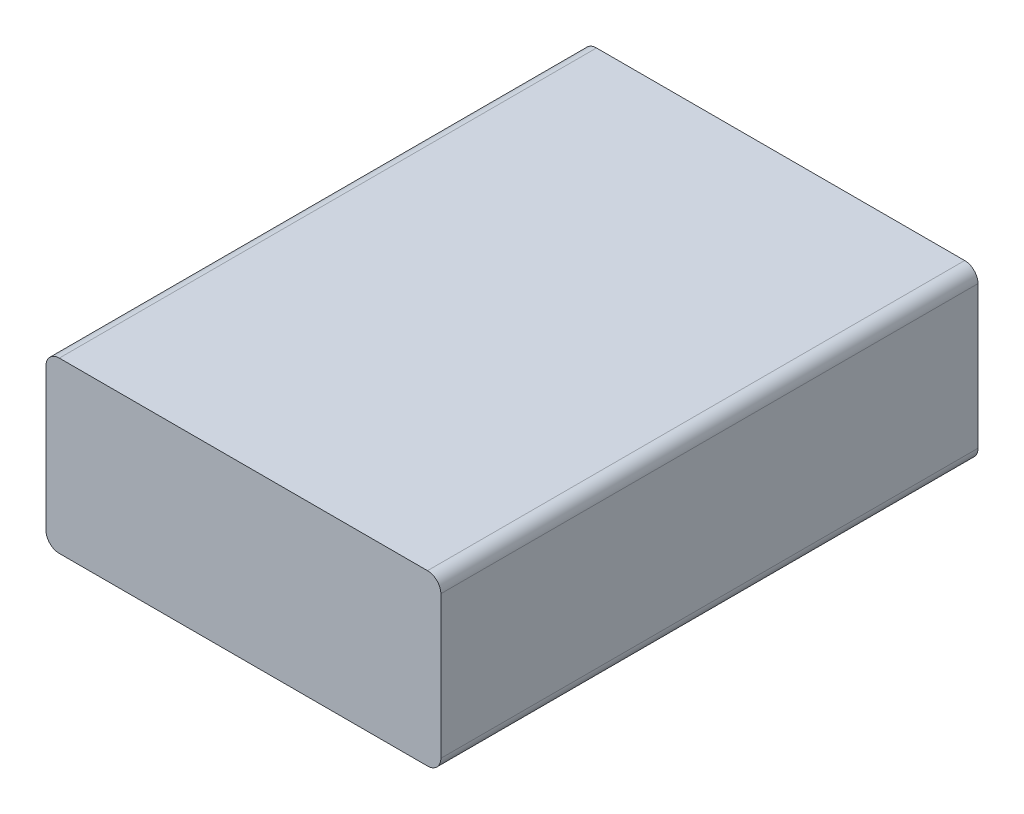
ISO-10303-21;
HEADER;
FILE_DESCRIPTION(('STEP AP214'),'2;1');
FILE_NAME('part.step','',(''),(''),'','','');
FILE_SCHEMA(('AUTOMOTIVE_DESIGN { 1 0 10303 214 1 1 1 1 }'));
ENDSEC;
DATA;
#1=APPLICATION_CONTEXT('core data for automotive mechanical design processes');
#2=APPLICATION_PROTOCOL_DEFINITION('international standard','automotive_design',2000,#1);
#3=PRODUCT_CONTEXT('',#1,'mechanical');
#4=PRODUCT('Part','Part','',(#3));
#5=PRODUCT_RELATED_PRODUCT_CATEGORY('part','',(#4));
#6=PRODUCT_DEFINITION_FORMATION('','',#4);
#7=PRODUCT_DEFINITION_CONTEXT('part definition',#1,'design');
#8=PRODUCT_DEFINITION('design','',#6,#7);
#9=PRODUCT_DEFINITION_SHAPE('','',#8);
#10=(LENGTH_UNIT() NAMED_UNIT(*) SI_UNIT(.MILLI.,.METRE.));
#11=(NAMED_UNIT(*) PLANE_ANGLE_UNIT() SI_UNIT($,.RADIAN.));
#12=(NAMED_UNIT(*) SI_UNIT($,.STERADIAN.) SOLID_ANGLE_UNIT());
#13=UNCERTAINTY_MEASURE_WITH_UNIT(LENGTH_MEASURE(1.E-05),#10,'distance_accuracy_value','');
#14=(GEOMETRIC_REPRESENTATION_CONTEXT(3) GLOBAL_UNCERTAINTY_ASSIGNED_CONTEXT((#13)) GLOBAL_UNIT_ASSIGNED_CONTEXT((#10,
#11,#12)) REPRESENTATION_CONTEXT('',''));
#15=CARTESIAN_POINT('',(0.,0.,0.));
#16=DIRECTION('',(0.,0.,1.));
#17=DIRECTION('',(1.,0.,0.));
#18=AXIS2_PLACEMENT_3D('',#15,#16,#17);
#19=CARTESIAN_POINT('',(-41.45,-16.05,120.95));
#20=DIRECTION('',(0.,0.,-1.));
#21=DIRECTION('',(-1.,0.,0.));
#22=AXIS2_PLACEMENT_3D('',#19,#20,#21);
#23=CYLINDRICAL_SURFACE('',#22,3.);
#24=CARTESIAN_POINT('',(-41.45,-16.05,0.));
#25=DIRECTION('',(0.,0.,1.));
#26=DIRECTION('',(-1.,0.,0.));
#27=AXIS2_PLACEMENT_3D('',#24,#25,#26);
#28=CIRCLE('',#27,3.);
#29=CARTESIAN_POINT('',(-44.45,-16.05,0.));
#30=VERTEX_POINT('',#29);
#31=CARTESIAN_POINT('',(-41.45,-19.05,0.));
#32=VERTEX_POINT('',#31);
#33=EDGE_CURVE('E146',#30,#32,#28,.T.);
#34=ORIENTED_EDGE('',*,*,#33,.T.);
#35=DIRECTION('',(0.,0.,-1.));
#36=VECTOR('',#35,1.);
#37=CARTESIAN_POINT('',(-41.45,-19.05,120.95));
#38=LINE('',#37,#36);
#39=CARTESIAN_POINT('',(-41.45,-19.05,120.95));
#40=VERTEX_POINT('',#39);
#41=EDGE_CURVE('E11',#40,#32,#38,.T.);
#42=ORIENTED_EDGE('',*,*,#41,.F.);
#43=CARTESIAN_POINT('',(-41.45,-16.05,120.95));
#44=DIRECTION('',(0.,0.,1.));
#45=DIRECTION('',(-1.,0.,0.));
#46=AXIS2_PLACEMENT_3D('',#43,#44,#45);
#47=CIRCLE('',#46,3.);
#48=CARTESIAN_POINT('',(-44.45,-16.05,120.95));
#49=VERTEX_POINT('',#48);
#50=EDGE_CURVE('E168',#49,#40,#47,.T.);
#51=ORIENTED_EDGE('',*,*,#50,.F.);
#52=DIRECTION('',(0.,0.,-1.));
#53=VECTOR('',#52,1.);
#54=CARTESIAN_POINT('',(-44.45,-16.05,120.95));
#55=LINE('',#54,#53);
#56=EDGE_CURVE('E142',#49,#30,#55,.T.);
#57=ORIENTED_EDGE('',*,*,#56,.T.);
#58=EDGE_LOOP('',(#34,#42,#51,#57));
#59=FACE_BOUND('',#58,.T.);
#60=ADVANCED_FACE('F45',(#59),#23,.T.);
#61=CARTESIAN_POINT('',(41.45,-19.05,120.95));
#62=DIRECTION('',(0.,1.,0.));
#63=DIRECTION('',(-1.,0.,0.));
#64=AXIS2_PLACEMENT_3D('',#61,#62,#63);
#65=PLANE('',#64);
#66=DIRECTION('',(1.,0.,0.));
#67=VECTOR('',#66,1.);
#68=CARTESIAN_POINT('',(41.45,-19.05,0.));
#69=LINE('',#68,#67);
#70=CARTESIAN_POINT('',(41.45,-19.05,0.));
#71=VERTEX_POINT('',#70);
#72=EDGE_CURVE('E150',#32,#71,#69,.T.);
#73=ORIENTED_EDGE('',*,*,#72,.T.);
#74=DIRECTION('',(0.,0.,-1.));
#75=VECTOR('',#74,1.);
#76=CARTESIAN_POINT('',(41.45,-19.05,120.95));
#77=LINE('',#76,#75);
#78=CARTESIAN_POINT('',(41.45,-19.05,120.95));
#79=VERTEX_POINT('',#78);
#80=EDGE_CURVE('E54',#79,#71,#77,.T.);
#81=ORIENTED_EDGE('',*,*,#80,.F.);
#82=DIRECTION('',(1.,0.,0.));
#83=VECTOR('',#82,1.);
#84=CARTESIAN_POINT('',(41.45,-19.05,120.95));
#85=LINE('',#84,#83);
#86=EDGE_CURVE('E105',#40,#79,#85,.T.);
#87=ORIENTED_EDGE('',*,*,#86,.F.);
#88=ORIENTED_EDGE('',*,*,#41,.T.);
#89=EDGE_LOOP('',(#73,#81,#87,#88));
#90=FACE_BOUND('',#89,.T.);
#91=ADVANCED_FACE('F214',(#90),#65,.F.);
#92=CARTESIAN_POINT('',(41.45,-16.05,120.95));
#93=DIRECTION('',(0.,0.,-1.));
#94=DIRECTION('',(-1.,0.,0.));
#95=AXIS2_PLACEMENT_3D('',#92,#93,#94);
#96=CYLINDRICAL_SURFACE('',#95,3.);
#97=CARTESIAN_POINT('',(41.45,-16.05,0.));
#98=DIRECTION('',(0.,0.,1.));
#99=DIRECTION('',(1.,0.,0.));
#100=AXIS2_PLACEMENT_3D('',#97,#98,#99);
#101=CIRCLE('',#100,3.);
#102=CARTESIAN_POINT('',(44.45,-16.05,0.));
#103=VERTEX_POINT('',#102);
#104=EDGE_CURVE('E153',#71,#103,#101,.T.);
#105=ORIENTED_EDGE('',*,*,#104,.T.);
#106=DIRECTION('',(0.,0.,-1.));
#107=VECTOR('',#106,1.);
#108=CARTESIAN_POINT('',(44.45,-16.05,120.95));
#109=LINE('',#108,#107);
#110=CARTESIAN_POINT('',(44.45,-16.05,120.95));
#111=VERTEX_POINT('',#110);
#112=EDGE_CURVE('E179',#111,#103,#109,.T.);
#113=ORIENTED_EDGE('',*,*,#112,.F.);
#114=CARTESIAN_POINT('',(41.45,-16.05,120.95));
#115=DIRECTION('',(0.,0.,1.));
#116=DIRECTION('',(1.,0.,0.));
#117=AXIS2_PLACEMENT_3D('',#114,#115,#116);
#118=CIRCLE('',#117,3.);
#119=EDGE_CURVE('E189',#79,#111,#118,.T.);
#120=ORIENTED_EDGE('',*,*,#119,.F.);
#121=ORIENTED_EDGE('',*,*,#80,.T.);
#122=EDGE_LOOP('',(#105,#113,#120,#121));
#123=FACE_BOUND('',#122,.T.);
#124=ADVANCED_FACE('F187',(#123),#96,.T.);
#125=CARTESIAN_POINT('',(44.45,-16.05,120.95));
#126=DIRECTION('',(-1.,0.,0.));
#127=DIRECTION('',(0.,0.,1.));
#128=AXIS2_PLACEMENT_3D('',#125,#126,#127);
#129=PLANE('',#128);
#130=DIRECTION('',(0.,1.,0.));
#131=VECTOR('',#130,1.);
#132=CARTESIAN_POINT('',(44.45,-16.05,0.));
#133=LINE('',#132,#131);
#134=CARTESIAN_POINT('',(44.45,16.05,0.));
#135=VERTEX_POINT('',#134);
#136=EDGE_CURVE('E156',#103,#135,#133,.T.);
#137=ORIENTED_EDGE('',*,*,#136,.T.);
#138=DIRECTION('',(0.,0.,-1.));
#139=VECTOR('',#138,1.);
#140=CARTESIAN_POINT('',(44.45,16.05,120.95));
#141=LINE('',#140,#139);
#142=CARTESIAN_POINT('',(44.45,16.05,120.95));
#143=VERTEX_POINT('',#142);
#144=EDGE_CURVE('E175',#143,#135,#141,.T.);
#145=ORIENTED_EDGE('',*,*,#144,.F.);
#146=DIRECTION('',(0.,1.,0.));
#147=VECTOR('',#146,1.);
#148=CARTESIAN_POINT('',(44.45,-16.05,120.95));
#149=LINE('',#148,#147);
#150=EDGE_CURVE('E202',#111,#143,#149,.T.);
#151=ORIENTED_EDGE('',*,*,#150,.F.);
#152=ORIENTED_EDGE('',*,*,#112,.T.);
#153=EDGE_LOOP('',(#137,#145,#151,#152));
#154=FACE_BOUND('',#153,.T.);
#155=ADVANCED_FACE('F197',(#154),#129,.F.);
#156=CARTESIAN_POINT('',(41.45,16.05,120.95));
#157=DIRECTION('',(0.,0.,-1.));
#158=DIRECTION('',(-1.,0.,0.));
#159=AXIS2_PLACEMENT_3D('',#156,#157,#158);
#160=CYLINDRICAL_SURFACE('',#159,3.);
#161=CARTESIAN_POINT('',(41.45,16.05,0.));
#162=DIRECTION('',(0.,0.,1.));
#163=DIRECTION('',(1.,0.,0.));
#164=AXIS2_PLACEMENT_3D('',#161,#162,#163);
#165=CIRCLE('',#164,3.);
#166=CARTESIAN_POINT('',(41.45,19.05,0.));
#167=VERTEX_POINT('',#166);
#168=EDGE_CURVE('E159',#135,#167,#165,.T.);
#169=ORIENTED_EDGE('',*,*,#168,.T.);
#170=DIRECTION('',(0.,0.,-1.));
#171=VECTOR('',#170,1.);
#172=CARTESIAN_POINT('',(41.45,19.05,120.95));
#173=LINE('',#172,#171);
#174=CARTESIAN_POINT('',(41.45,19.05,120.95));
#175=VERTEX_POINT('',#174);
#176=EDGE_CURVE('E135',#175,#167,#173,.T.);
#177=ORIENTED_EDGE('',*,*,#176,.F.);
#178=CARTESIAN_POINT('',(41.45,16.05,120.95));
#179=DIRECTION('',(0.,0.,1.));
#180=DIRECTION('',(1.,0.,0.));
#181=AXIS2_PLACEMENT_3D('',#178,#179,#180);
#182=CIRCLE('',#181,3.);
#183=EDGE_CURVE('E124',#143,#175,#182,.T.);
#184=ORIENTED_EDGE('',*,*,#183,.F.);
#185=ORIENTED_EDGE('',*,*,#144,.T.);
#186=EDGE_LOOP('',(#169,#177,#184,#185));
#187=FACE_BOUND('',#186,.T.);
#188=ADVANCED_FACE('F200',(#187),#160,.T.);
#189=CARTESIAN_POINT('',(41.45,19.05,120.95));
#190=DIRECTION('',(0.,-1.,0.));
#191=DIRECTION('',(1.,0.,0.));
#192=AXIS2_PLACEMENT_3D('',#189,#190,#191);
#193=PLANE('',#192);
#194=DIRECTION('',(-1.,0.,0.));
#195=VECTOR('',#194,1.);
#196=CARTESIAN_POINT('',(41.45,19.05,0.));
#197=LINE('',#196,#195);
#198=CARTESIAN_POINT('',(-41.45,19.05,0.));
#199=VERTEX_POINT('',#198);
#200=EDGE_CURVE('E133',#167,#199,#197,.T.);
#201=ORIENTED_EDGE('',*,*,#200,.T.);
#202=DIRECTION('',(0.,0.,-1.));
#203=VECTOR('',#202,1.);
#204=CARTESIAN_POINT('',(-41.45,19.05,120.95));
#205=LINE('',#204,#203);
#206=CARTESIAN_POINT('',(-41.45,19.05,120.95));
#207=VERTEX_POINT('',#206);
#208=EDGE_CURVE('E130',#207,#199,#205,.T.);
#209=ORIENTED_EDGE('',*,*,#208,.F.);
#210=DIRECTION('',(-1.,0.,0.));
#211=VECTOR('',#210,1.);
#212=CARTESIAN_POINT('',(41.45,19.05,120.95));
#213=LINE('',#212,#211);
#214=EDGE_CURVE('E118',#175,#207,#213,.T.);
#215=ORIENTED_EDGE('',*,*,#214,.F.);
#216=ORIENTED_EDGE('',*,*,#176,.T.);
#217=EDGE_LOOP('',(#201,#209,#215,#216));
#218=FACE_BOUND('',#217,.T.);
#219=ADVANCED_FACE('F131',(#218),#193,.F.);
#220=CARTESIAN_POINT('',(-41.45,16.05,120.95));
#221=DIRECTION('',(0.,0.,-1.));
#222=DIRECTION('',(-1.,0.,0.));
#223=AXIS2_PLACEMENT_3D('',#220,#221,#222);
#224=CYLINDRICAL_SURFACE('',#223,3.);
#225=CARTESIAN_POINT('',(-41.45,16.05,0.));
#226=DIRECTION('',(0.,0.,1.));
#227=DIRECTION('',(1.,0.,0.));
#228=AXIS2_PLACEMENT_3D('',#225,#226,#227);
#229=CIRCLE('',#228,3.);
#230=CARTESIAN_POINT('',(-44.45,16.05,0.));
#231=VERTEX_POINT('',#230);
#232=EDGE_CURVE('E91',#199,#231,#229,.T.);
#233=ORIENTED_EDGE('',*,*,#232,.T.);
#234=DIRECTION('',(0.,0.,-1.));
#235=VECTOR('',#234,1.);
#236=CARTESIAN_POINT('',(-44.45,16.05,120.95));
#237=LINE('',#236,#235);
#238=CARTESIAN_POINT('',(-44.45,16.05,120.95));
#239=VERTEX_POINT('',#238);
#240=EDGE_CURVE('E136',#239,#231,#237,.T.);
#241=ORIENTED_EDGE('',*,*,#240,.F.);
#242=CARTESIAN_POINT('',(-41.45,16.05,120.95));
#243=DIRECTION('',(0.,0.,1.));
#244=DIRECTION('',(1.,0.,0.));
#245=AXIS2_PLACEMENT_3D('',#242,#243,#244);
#246=CIRCLE('',#245,3.);
#247=EDGE_CURVE('E122',#207,#239,#246,.T.);
#248=ORIENTED_EDGE('',*,*,#247,.F.);
#249=ORIENTED_EDGE('',*,*,#208,.T.);
#250=EDGE_LOOP('',(#233,#241,#248,#249));
#251=FACE_BOUND('',#250,.T.);
#252=ADVANCED_FACE('F138',(#251),#224,.T.);
#253=CARTESIAN_POINT('',(-44.45,-16.05,120.95));
#254=DIRECTION('',(1.,0.,0.));
#255=DIRECTION('',(0.,0.,-1.));
#256=AXIS2_PLACEMENT_3D('',#253,#254,#255);
#257=PLANE('',#256);
#258=DIRECTION('',(0.,-1.,0.));
#259=VECTOR('',#258,1.);
#260=CARTESIAN_POINT('',(-44.45,-16.05,0.));
#261=LINE('',#260,#259);
#262=EDGE_CURVE('E97',#231,#30,#261,.T.);
#263=ORIENTED_EDGE('',*,*,#262,.T.);
#264=ORIENTED_EDGE('',*,*,#56,.F.);
#265=DIRECTION('',(0.,-1.,0.));
#266=VECTOR('',#265,1.);
#267=CARTESIAN_POINT('',(-44.45,-16.05,120.95));
#268=LINE('',#267,#266);
#269=EDGE_CURVE('E62',#239,#49,#268,.T.);
#270=ORIENTED_EDGE('',*,*,#269,.F.);
#271=ORIENTED_EDGE('',*,*,#240,.T.);
#272=EDGE_LOOP('',(#263,#264,#270,#271));
#273=FACE_BOUND('',#272,.T.);
#274=ADVANCED_FACE('F230',(#273),#257,.F.);
#275=CARTESIAN_POINT('',(-41.45,-16.05,120.95));
#276=DIRECTION('',(0.,0.,-1.));
#277=DIRECTION('',(-1.,0.,0.));
#278=AXIS2_PLACEMENT_3D('',#275,#276,#277);
#279=PLANE('',#278);
#280=ORIENTED_EDGE('',*,*,#50,.T.);
#281=ORIENTED_EDGE('',*,*,#86,.T.);
#282=ORIENTED_EDGE('',*,*,#119,.T.);
#283=ORIENTED_EDGE('',*,*,#150,.T.);
#284=ORIENTED_EDGE('',*,*,#183,.T.);
#285=ORIENTED_EDGE('',*,*,#214,.T.);
#286=ORIENTED_EDGE('',*,*,#247,.T.);
#287=ORIENTED_EDGE('',*,*,#269,.T.);
#288=EDGE_LOOP('',(#280,#281,#282,#283,#284,#285,#286,#287));
#289=FACE_BOUND('',#288,.T.);
#290=ADVANCED_FACE('F120',(#289),#279,.F.);
#291=CARTESIAN_POINT('',(-41.45,-16.05,0.));
#292=DIRECTION('',(0.,0.,-1.));
#293=DIRECTION('',(-1.,0.,0.));
#294=AXIS2_PLACEMENT_3D('',#291,#292,#293);
#295=PLANE('',#294);
#296=ORIENTED_EDGE('',*,*,#33,.F.);
#297=ORIENTED_EDGE('',*,*,#262,.F.);
#298=ORIENTED_EDGE('',*,*,#232,.F.);
#299=ORIENTED_EDGE('',*,*,#200,.F.);
#300=ORIENTED_EDGE('',*,*,#168,.F.);
#301=ORIENTED_EDGE('',*,*,#136,.F.);
#302=ORIENTED_EDGE('',*,*,#104,.F.);
#303=ORIENTED_EDGE('',*,*,#72,.F.);
#304=EDGE_LOOP('',(#296,#297,#298,#299,#300,#301,#302,#303));
#305=FACE_BOUND('',#304,.T.);
#306=ADVANCED_FACE('F193',(#305),#295,.T.);
#307=CLOSED_SHELL('',(#60,#91,#124,#155,#188,#219,#252,#274,#290,#306));
#308=MANIFOLD_SOLID_BREP('B2',#307);
#309=ADVANCED_BREP_SHAPE_REPRESENTATION('',(#18,#308),#14);
#310=SHAPE_DEFINITION_REPRESENTATION(#9,#309);
ENDSEC;
END-ISO-10303-21;
